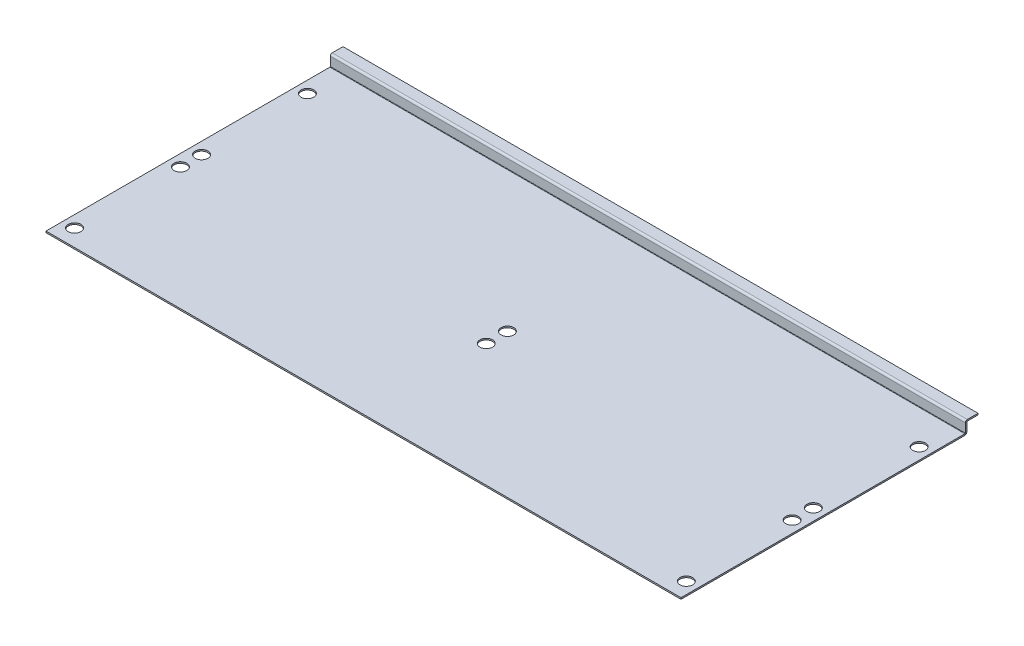
ISO-10303-21;
HEADER;
FILE_DESCRIPTION(('STEP AP214'),'2;1');
FILE_NAME('part.step','',(''),(''),'','','');
FILE_SCHEMA(('AUTOMOTIVE_DESIGN { 1 0 10303 214 1 1 1 1 }'));
ENDSEC;
DATA;
#1=APPLICATION_CONTEXT('core data for automotive mechanical design processes');
#2=APPLICATION_PROTOCOL_DEFINITION('international standard','automotive_design',2000,#1);
#3=PRODUCT_CONTEXT('',#1,'mechanical');
#4=PRODUCT('Part','Part','',(#3));
#5=PRODUCT_RELATED_PRODUCT_CATEGORY('part','',(#4));
#6=PRODUCT_DEFINITION_FORMATION('','',#4);
#7=PRODUCT_DEFINITION_CONTEXT('part definition',#1,'design');
#8=PRODUCT_DEFINITION('design','',#6,#7);
#9=PRODUCT_DEFINITION_SHAPE('','',#8);
#10=(LENGTH_UNIT() NAMED_UNIT(*) SI_UNIT(.MILLI.,.METRE.));
#11=(NAMED_UNIT(*) PLANE_ANGLE_UNIT() SI_UNIT($,.RADIAN.));
#12=(NAMED_UNIT(*) SI_UNIT($,.STERADIAN.) SOLID_ANGLE_UNIT());
#13=UNCERTAINTY_MEASURE_WITH_UNIT(LENGTH_MEASURE(1.E-05),#10,'distance_accuracy_value','');
#14=(GEOMETRIC_REPRESENTATION_CONTEXT(3) GLOBAL_UNCERTAINTY_ASSIGNED_CONTEXT((#13)) GLOBAL_UNIT_ASSIGNED_CONTEXT((#10,
#11,#12)) REPRESENTATION_CONTEXT('',''));
#15=CARTESIAN_POINT('',(0.,0.,0.));
#16=DIRECTION('',(0.,0.,1.));
#17=DIRECTION('',(1.,0.,0.));
#18=AXIS2_PLACEMENT_3D('',#15,#16,#17);
#19=CARTESIAN_POINT('',(150.,4.6,-67.5000000000001));
#20=DIRECTION('',(-1.,0.,0.));
#21=DIRECTION('',(0.,0.,1.));
#22=AXIS2_PLACEMENT_3D('',#19,#20,#21);
#23=PLANE('',#22);
#24=DIRECTION('',(0.,0.,1.));
#25=VECTOR('',#24,1.);
#26=CARTESIAN_POINT('',(150.,3.70000000000001,-67.5));
#27=LINE('',#26,#25);
#28=CARTESIAN_POINT('',(150.,3.70000000000001,-67.5));
#29=VERTEX_POINT('',#28);
#30=CARTESIAN_POINT('',(150.,3.70000000000001,-66.8000000000001));
#31=VERTEX_POINT('',#30);
#32=EDGE_CURVE('E247',#29,#31,#27,.T.);
#33=ORIENTED_EDGE('',*,*,#32,.T.);
#34=DIRECTION('',(0.,-1.,0.));
#35=VECTOR('',#34,1.);
#36=CARTESIAN_POINT('',(150.,4.6,-66.8000000000001));
#37=LINE('',#36,#35);
#38=CARTESIAN_POINT('',(150.,-0.49999999999998,-66.8));
#39=VERTEX_POINT('',#38);
#40=EDGE_CURVE('E268',#39,#31,#37,.F.);
#41=ORIENTED_EDGE('',*,*,#40,.F.);
#42=DIRECTION('',(0.,0.,1.));
#43=VECTOR('',#42,1.);
#44=CARTESIAN_POINT('',(150.,-0.499999999999974,-66.8));
#45=LINE('',#44,#43);
#46=CARTESIAN_POINT('',(150.,-0.499999999999979,-67.5000000000001));
#47=VERTEX_POINT('',#46);
#48=EDGE_CURVE('E276',#39,#47,#45,.F.);
#49=ORIENTED_EDGE('',*,*,#48,.T.);
#50=DIRECTION('',(0.,1.,0.));
#51=VECTOR('',#50,1.);
#52=CARTESIAN_POINT('',(150.,-1.40000000000018,-67.5000000000001));
#53=LINE('',#52,#51);
#54=EDGE_CURVE('E260',#47,#29,#53,.T.);
#55=ORIENTED_EDGE('',*,*,#54,.T.);
#56=EDGE_LOOP('',(#33,#41,#49,#55));
#57=FACE_BOUND('',#56,.T.);
#58=ADVANCED_FACE('F81',(#57),#23,.F.);
#59=CARTESIAN_POINT('',(-150.,-0.700000000000003,-67.5));
#60=DIRECTION('',(1.,0.,0.));
#61=DIRECTION('',(0.,0.,-1.));
#62=AXIS2_PLACEMENT_3D('',#59,#60,#61);
#63=PLANE('',#62);
#64=DIRECTION('',(0.,0.,1.));
#65=VECTOR('',#64,1.);
#66=CARTESIAN_POINT('',(-150.,3.70000000000001,-67.5));
#67=LINE('',#66,#65);
#68=CARTESIAN_POINT('',(-150.,3.70000000000001,-67.5));
#69=VERTEX_POINT('',#68);
#70=CARTESIAN_POINT('',(-150.,3.70000000000001,-66.8000000000001));
#71=VERTEX_POINT('',#70);
#72=EDGE_CURVE('E234',#69,#71,#67,.T.);
#73=ORIENTED_EDGE('',*,*,#72,.F.);
#74=DIRECTION('',(0.,-1.,0.));
#75=VECTOR('',#74,1.);
#76=CARTESIAN_POINT('',(-150.,-1.40000000000018,-67.5));
#77=LINE('',#76,#75);
#78=CARTESIAN_POINT('',(-150.,-0.499999999999982,-67.5));
#79=VERTEX_POINT('',#78);
#80=EDGE_CURVE('E255',#69,#79,#77,.T.);
#81=ORIENTED_EDGE('',*,*,#80,.T.);
#82=DIRECTION('',(0.,0.,1.));
#83=VECTOR('',#82,1.);
#84=CARTESIAN_POINT('',(-150.,-0.499999999999993,-67.5));
#85=LINE('',#84,#83);
#86=CARTESIAN_POINT('',(-150.,-0.49999999999998,-66.8));
#87=VERTEX_POINT('',#86);
#88=EDGE_CURVE('E251',#87,#79,#85,.F.);
#89=ORIENTED_EDGE('',*,*,#88,.F.);
#90=DIRECTION('',(0.,1.,0.));
#91=VECTOR('',#90,1.);
#92=CARTESIAN_POINT('',(-150.,-0.700000000000001,-66.8));
#93=LINE('',#92,#91);
#94=EDGE_CURVE('E264',#71,#87,#93,.F.);
#95=ORIENTED_EDGE('',*,*,#94,.F.);
#96=EDGE_LOOP('',(#73,#81,#89,#95));
#97=FACE_BOUND('',#96,.T.);
#98=ADVANCED_FACE('F449',(#97),#63,.F.);
#99=CARTESIAN_POINT('',(0.,-1.40000000000018,-67.5));
#100=DIRECTION('',(0.,0.,1.));
#101=DIRECTION('',(0.,1.,0.));
#102=AXIS2_PLACEMENT_3D('',#99,#100,#101);
#103=PLANE('',#102);
#104=DIRECTION('',(-1.,0.,0.));
#105=VECTOR('',#104,1.);
#106=CARTESIAN_POINT('',(-150.,3.70000000000001,-67.5));
#107=LINE('',#106,#105);
#108=EDGE_CURVE('E241',#69,#29,#107,.F.);
#109=ORIENTED_EDGE('',*,*,#108,.T.);
#110=ORIENTED_EDGE('',*,*,#54,.F.);
#111=DIRECTION('',(1.,0.,0.));
#112=VECTOR('',#111,1.);
#113=CARTESIAN_POINT('',(-150.,-0.499999999999993,-67.5));
#114=LINE('',#113,#112);
#115=EDGE_CURVE('E272',#47,#79,#114,.F.);
#116=ORIENTED_EDGE('',*,*,#115,.T.);
#117=ORIENTED_EDGE('',*,*,#80,.F.);
#118=EDGE_LOOP('',(#109,#110,#116,#117));
#119=FACE_BOUND('',#118,.T.);
#120=ADVANCED_FACE('F451',(#119),#103,.F.);
#121=CARTESIAN_POINT('',(0.,-1.40000000000018,-66.8));
#122=DIRECTION('',(0.,0.,1.));
#123=DIRECTION('',(0.,1.,0.));
#124=AXIS2_PLACEMENT_3D('',#121,#122,#123);
#125=PLANE('',#124);
#126=ORIENTED_EDGE('',*,*,#94,.T.);
#127=DIRECTION('',(1.,0.,0.));
#128=VECTOR('',#127,1.);
#129=CARTESIAN_POINT('',(-150.,-0.499999999999988,-66.8));
#130=LINE('',#129,#128);
#131=EDGE_CURVE('E280',#87,#39,#130,.T.);
#132=ORIENTED_EDGE('',*,*,#131,.T.);
#133=ORIENTED_EDGE('',*,*,#40,.T.);
#134=DIRECTION('',(-1.,0.,0.));
#135=VECTOR('',#134,1.);
#136=CARTESIAN_POINT('',(-150.,3.70000000000001,-66.8000000000001));
#137=LINE('',#136,#135);
#138=EDGE_CURVE('E228',#71,#31,#137,.F.);
#139=ORIENTED_EDGE('',*,*,#138,.F.);
#140=EDGE_LOOP('',(#126,#132,#133,#139));
#141=FACE_BOUND('',#140,.T.);
#142=ADVANCED_FACE('F456',(#141),#125,.T.);
#143=CARTESIAN_POINT('',(150.,-0.7,-67.5));
#144=DIRECTION('',(1.,0.,0.));
#145=DIRECTION('',(0.,0.,-1.));
#146=AXIS2_PLACEMENT_3D('',#143,#144,#145);
#147=PLANE('',#146);
#148=DIRECTION('',(0.,0.,-1.));
#149=VECTOR('',#148,1.);
#150=CARTESIAN_POINT('',(150.,-0.7,-67.5));
#151=LINE('',#150,#149);
#152=CARTESIAN_POINT('',(150.,-0.7,67.5));
#153=VERTEX_POINT('',#152);
#154=CARTESIAN_POINT('',(150.,-0.699999999999958,-66.6000000000001));
#155=VERTEX_POINT('',#154);
#156=EDGE_CURVE('E392',#153,#155,#151,.T.);
#157=ORIENTED_EDGE('',*,*,#156,.F.);
#158=DIRECTION('',(0.,-1.,0.));
#159=VECTOR('',#158,1.);
#160=CARTESIAN_POINT('',(150.,-0.7,67.5));
#161=LINE('',#160,#159);
#162=CARTESIAN_POINT('',(150.,-1.4,67.5));
#163=VERTEX_POINT('',#162);
#164=EDGE_CURVE('E13',#153,#163,#161,.T.);
#165=ORIENTED_EDGE('',*,*,#164,.T.);
#166=DIRECTION('',(0.,0.,-1.));
#167=VECTOR('',#166,1.);
#168=CARTESIAN_POINT('',(150.,-1.4,-67.5));
#169=LINE('',#168,#167);
#170=CARTESIAN_POINT('',(150.,-1.39999999999996,-66.6000000000002));
#171=VERTEX_POINT('',#170);
#172=EDGE_CURVE('E388',#163,#171,#169,.T.);
#173=ORIENTED_EDGE('',*,*,#172,.T.);
#174=DIRECTION('',(0.,-1.,-1.3877787807816E-13));
#175=VECTOR('',#174,1.);
#176=CARTESIAN_POINT('',(150.,-0.699999999999958,-66.6000000000001));
#177=LINE('',#176,#175);
#178=EDGE_CURVE('E293',#155,#171,#177,.T.);
#179=ORIENTED_EDGE('',*,*,#178,.F.);
#180=EDGE_LOOP('',(#157,#165,#173,#179));
#181=FACE_BOUND('',#180,.T.);
#182=ADVANCED_FACE('F83',(#181),#147,.T.);
#183=CARTESIAN_POINT('',(0.,-0.7,0.));
#184=DIRECTION('',(0.,-1.,0.));
#185=DIRECTION('',(0.,0.,1.));
#186=AXIS2_PLACEMENT_3D('',#183,#184,#185);
#187=PLANE('',#186);
#188=CARTESIAN_POINT('',(-144.5,-0.7,59.5));
#189=DIRECTION('',(0.,1.,0.));
#190=DIRECTION('',(0.,0.,1.));
#191=AXIS2_PLACEMENT_3D('',#188,#189,#190);
#192=CIRCLE('',#191,2.99999999999999);
#193=CARTESIAN_POINT('',(-144.5,-0.7,62.5));
#194=VERTEX_POINT('',#193);
#195=EDGE_CURVE('E384',#194,#194,#192,.T.);
#196=ORIENTED_EDGE('',*,*,#195,.F.);
#197=EDGE_LOOP('',(#196));
#198=FACE_BOUND('',#197,.T.);
#199=CARTESIAN_POINT('',(-144.5,-0.7,9.5));
#200=DIRECTION('',(0.,1.,0.));
#201=DIRECTION('',(0.,0.,1.));
#202=AXIS2_PLACEMENT_3D('',#199,#200,#201);
#203=CIRCLE('',#202,2.99999999999999);
#204=CARTESIAN_POINT('',(-144.5,-0.7,12.5));
#205=VERTEX_POINT('',#204);
#206=EDGE_CURVE('E376',#205,#205,#203,.T.);
#207=ORIENTED_EDGE('',*,*,#206,.F.);
#208=EDGE_LOOP('',(#207));
#209=FACE_BOUND('',#208,.T.);
#210=CARTESIAN_POINT('',(-144.5,-0.7,-0.499999999999999));
#211=DIRECTION('',(0.,1.,0.));
#212=DIRECTION('',(0.,0.,1.));
#213=AXIS2_PLACEMENT_3D('',#210,#211,#212);
#214=CIRCLE('',#213,2.99999999999999);
#215=CARTESIAN_POINT('',(-144.5,-0.7,2.5));
#216=VERTEX_POINT('',#215);
#217=EDGE_CURVE('E368',#216,#216,#214,.T.);
#218=ORIENTED_EDGE('',*,*,#217,.F.);
#219=EDGE_LOOP('',(#218));
#220=FACE_BOUND('',#219,.T.);
#221=CARTESIAN_POINT('',(-144.5,-0.7,-50.5));
#222=DIRECTION('',(0.,1.,0.));
#223=DIRECTION('',(0.,0.,1.));
#224=AXIS2_PLACEMENT_3D('',#221,#222,#223);
#225=CIRCLE('',#224,2.99999999999999);
#226=CARTESIAN_POINT('',(-144.5,-0.7,-47.5));
#227=VERTEX_POINT('',#226);
#228=EDGE_CURVE('E360',#227,#227,#225,.T.);
#229=ORIENTED_EDGE('',*,*,#228,.F.);
#230=EDGE_LOOP('',(#229));
#231=FACE_BOUND('',#230,.T.);
#232=CARTESIAN_POINT('',(144.5,-0.7,59.5));
#233=DIRECTION('',(0.,1.,0.));
#234=DIRECTION('',(0.,0.,-1.));
#235=AXIS2_PLACEMENT_3D('',#232,#233,#234);
#236=CIRCLE('',#235,2.99999999999999);
#237=CARTESIAN_POINT('',(144.5,-0.7,56.5));
#238=VERTEX_POINT('',#237);
#239=EDGE_CURVE('E352',#238,#238,#236,.T.);
#240=ORIENTED_EDGE('',*,*,#239,.F.);
#241=EDGE_LOOP('',(#240));
#242=FACE_BOUND('',#241,.T.);
#243=CARTESIAN_POINT('',(144.5,-0.7,9.49999999999997));
#244=DIRECTION('',(0.,1.,0.));
#245=DIRECTION('',(0.,0.,-1.));
#246=AXIS2_PLACEMENT_3D('',#243,#244,#245);
#247=CIRCLE('',#246,2.99999999999999);
#248=CARTESIAN_POINT('',(144.5,-0.7,6.49999999999997));
#249=VERTEX_POINT('',#248);
#250=EDGE_CURVE('E344',#249,#249,#247,.T.);
#251=ORIENTED_EDGE('',*,*,#250,.F.);
#252=EDGE_LOOP('',(#251));
#253=FACE_BOUND('',#252,.T.);
#254=CARTESIAN_POINT('',(144.5,-0.7,-0.500000000000034));
#255=DIRECTION('',(0.,1.,0.));
#256=DIRECTION('',(0.,0.,-1.));
#257=AXIS2_PLACEMENT_3D('',#254,#255,#256);
#258=CIRCLE('',#257,2.99999999999999);
#259=CARTESIAN_POINT('',(144.5,-0.7,-3.50000000000003));
#260=VERTEX_POINT('',#259);
#261=EDGE_CURVE('E336',#260,#260,#258,.T.);
#262=ORIENTED_EDGE('',*,*,#261,.F.);
#263=EDGE_LOOP('',(#262));
#264=FACE_BOUND('',#263,.T.);
#265=CARTESIAN_POINT('',(144.5,-0.7,-50.5));
#266=DIRECTION('',(0.,1.,0.));
#267=DIRECTION('',(0.,0.,-1.));
#268=AXIS2_PLACEMENT_3D('',#265,#266,#267);
#269=CIRCLE('',#268,2.99999999999999);
#270=CARTESIAN_POINT('',(144.5,-0.7,-53.5));
#271=VERTEX_POINT('',#270);
#272=EDGE_CURVE('E328',#271,#271,#269,.T.);
#273=ORIENTED_EDGE('',*,*,#272,.F.);
#274=EDGE_LOOP('',(#273));
#275=FACE_BOUND('',#274,.T.);
#276=CARTESIAN_POINT('',(0.,-0.7,9.5));
#277=DIRECTION('',(0.,1.,0.));
#278=DIRECTION('',(0.,0.,1.));
#279=AXIS2_PLACEMENT_3D('',#276,#277,#278);
#280=CIRCLE('',#279,3.);
#281=CARTESIAN_POINT('',(0.,-0.7,12.5));
#282=VERTEX_POINT('',#281);
#283=EDGE_CURVE('E320',#282,#282,#280,.T.);
#284=ORIENTED_EDGE('',*,*,#283,.F.);
#285=EDGE_LOOP('',(#284));
#286=FACE_BOUND('',#285,.T.);
#287=CARTESIAN_POINT('',(0.,-0.7,-0.499999999999999));
#288=DIRECTION('',(0.,1.,0.));
#289=DIRECTION('',(0.,0.,1.));
#290=AXIS2_PLACEMENT_3D('',#287,#288,#289);
#291=CIRCLE('',#290,3.);
#292=CARTESIAN_POINT('',(0.,-0.7,2.5));
#293=VERTEX_POINT('',#292);
#294=EDGE_CURVE('E312',#293,#293,#291,.T.);
#295=ORIENTED_EDGE('',*,*,#294,.F.);
#296=EDGE_LOOP('',(#295));
#297=FACE_BOUND('',#296,.T.);
#298=DIRECTION('',(1.,0.,0.));
#299=VECTOR('',#298,1.);
#300=CARTESIAN_POINT('',(150.,-0.699999999999958,-66.6000000000001));
#301=LINE('',#300,#299);
#302=CARTESIAN_POINT('',(-150.,-0.699999999999958,-66.6000000000001));
#303=VERTEX_POINT('',#302);
#304=EDGE_CURVE('E299',#155,#303,#301,.F.);
#305=ORIENTED_EDGE('',*,*,#304,.T.);
#306=DIRECTION('',(0.,0.,1.));
#307=VECTOR('',#306,1.);
#308=CARTESIAN_POINT('',(-150.,-0.7,-67.5));
#309=LINE('',#308,#307);
#310=CARTESIAN_POINT('',(-150.,-0.7,67.5));
#311=VERTEX_POINT('',#310);
#312=EDGE_CURVE('E396',#303,#311,#309,.T.);
#313=ORIENTED_EDGE('',*,*,#312,.T.);
#314=DIRECTION('',(1.,0.,0.));
#315=VECTOR('',#314,1.);
#316=CARTESIAN_POINT('',(-150.,-0.7,67.5));
#317=LINE('',#316,#315);
#318=EDGE_CURVE('E401',#311,#153,#317,.T.);
#319=ORIENTED_EDGE('',*,*,#318,.T.);
#320=ORIENTED_EDGE('',*,*,#156,.T.);
#321=EDGE_LOOP('',(#305,#313,#319,#320));
#322=FACE_BOUND('',#321,.T.);
#323=ADVANCED_FACE('F426',(#198,#209,#220,#231,#242,#253,#264,#275,#286,#297,#322),#187,.F.);
#324=CARTESIAN_POINT('',(0.,-1.4,0.));
#325=DIRECTION('',(0.,-1.,0.));
#326=DIRECTION('',(0.,0.,1.));
#327=AXIS2_PLACEMENT_3D('',#324,#325,#326);
#328=PLANE('',#327);
#329=CARTESIAN_POINT('',(0.,-1.4,-0.499999999999999));
#330=DIRECTION('',(0.,1.,0.));
#331=DIRECTION('',(0.,0.,1.));
#332=AXIS2_PLACEMENT_3D('',#329,#330,#331);
#333=CIRCLE('',#332,3.);
#334=CARTESIAN_POINT('',(0.,-1.4,2.5));
#335=VERTEX_POINT('',#334);
#336=EDGE_CURVE('E308',#335,#335,#333,.T.);
#337=ORIENTED_EDGE('',*,*,#336,.T.);
#338=EDGE_LOOP('',(#337));
#339=FACE_BOUND('',#338,.T.);
#340=CARTESIAN_POINT('',(0.,-1.4,9.5));
#341=DIRECTION('',(0.,1.,0.));
#342=DIRECTION('',(0.,0.,1.));
#343=AXIS2_PLACEMENT_3D('',#340,#341,#342);
#344=CIRCLE('',#343,3.);
#345=CARTESIAN_POINT('',(0.,-1.4,12.5));
#346=VERTEX_POINT('',#345);
#347=EDGE_CURVE('E316',#346,#346,#344,.T.);
#348=ORIENTED_EDGE('',*,*,#347,.T.);
#349=EDGE_LOOP('',(#348));
#350=FACE_BOUND('',#349,.T.);
#351=CARTESIAN_POINT('',(144.5,-1.4,-50.5));
#352=DIRECTION('',(0.,1.,0.));
#353=DIRECTION('',(0.,0.,-1.));
#354=AXIS2_PLACEMENT_3D('',#351,#352,#353);
#355=CIRCLE('',#354,2.99999999999999);
#356=CARTESIAN_POINT('',(144.5,-1.4,-53.5));
#357=VERTEX_POINT('',#356);
#358=EDGE_CURVE('E324',#357,#357,#355,.T.);
#359=ORIENTED_EDGE('',*,*,#358,.T.);
#360=EDGE_LOOP('',(#359));
#361=FACE_BOUND('',#360,.T.);
#362=CARTESIAN_POINT('',(144.5,-1.4,-0.500000000000034));
#363=DIRECTION('',(0.,1.,0.));
#364=DIRECTION('',(0.,0.,-1.));
#365=AXIS2_PLACEMENT_3D('',#362,#363,#364);
#366=CIRCLE('',#365,2.99999999999999);
#367=CARTESIAN_POINT('',(144.5,-1.4,-3.50000000000003));
#368=VERTEX_POINT('',#367);
#369=EDGE_CURVE('E332',#368,#368,#366,.T.);
#370=ORIENTED_EDGE('',*,*,#369,.T.);
#371=EDGE_LOOP('',(#370));
#372=FACE_BOUND('',#371,.T.);
#373=CARTESIAN_POINT('',(144.5,-1.4,9.49999999999997));
#374=DIRECTION('',(0.,1.,0.));
#375=DIRECTION('',(0.,0.,-1.));
#376=AXIS2_PLACEMENT_3D('',#373,#374,#375);
#377=CIRCLE('',#376,2.99999999999999);
#378=CARTESIAN_POINT('',(144.5,-1.4,6.49999999999997));
#379=VERTEX_POINT('',#378);
#380=EDGE_CURVE('E340',#379,#379,#377,.T.);
#381=ORIENTED_EDGE('',*,*,#380,.T.);
#382=EDGE_LOOP('',(#381));
#383=FACE_BOUND('',#382,.T.);
#384=CARTESIAN_POINT('',(144.5,-1.4,59.5));
#385=DIRECTION('',(0.,1.,0.));
#386=DIRECTION('',(0.,0.,-1.));
#387=AXIS2_PLACEMENT_3D('',#384,#385,#386);
#388=CIRCLE('',#387,2.99999999999999);
#389=CARTESIAN_POINT('',(144.5,-1.4,56.5));
#390=VERTEX_POINT('',#389);
#391=EDGE_CURVE('E348',#390,#390,#388,.T.);
#392=ORIENTED_EDGE('',*,*,#391,.T.);
#393=EDGE_LOOP('',(#392));
#394=FACE_BOUND('',#393,.T.);
#395=CARTESIAN_POINT('',(-144.5,-1.4,-50.5));
#396=DIRECTION('',(0.,1.,0.));
#397=DIRECTION('',(0.,0.,1.));
#398=AXIS2_PLACEMENT_3D('',#395,#396,#397);
#399=CIRCLE('',#398,2.99999999999999);
#400=CARTESIAN_POINT('',(-144.5,-1.4,-47.5));
#401=VERTEX_POINT('',#400);
#402=EDGE_CURVE('E356',#401,#401,#399,.T.);
#403=ORIENTED_EDGE('',*,*,#402,.T.);
#404=EDGE_LOOP('',(#403));
#405=FACE_BOUND('',#404,.T.);
#406=CARTESIAN_POINT('',(-144.5,-1.4,-0.499999999999999));
#407=DIRECTION('',(0.,1.,0.));
#408=DIRECTION('',(0.,0.,1.));
#409=AXIS2_PLACEMENT_3D('',#406,#407,#408);
#410=CIRCLE('',#409,2.99999999999999);
#411=CARTESIAN_POINT('',(-144.5,-1.4,2.5));
#412=VERTEX_POINT('',#411);
#413=EDGE_CURVE('E364',#412,#412,#410,.T.);
#414=ORIENTED_EDGE('',*,*,#413,.T.);
#415=EDGE_LOOP('',(#414));
#416=FACE_BOUND('',#415,.T.);
#417=CARTESIAN_POINT('',(-144.5,-1.4,9.5));
#418=DIRECTION('',(0.,1.,0.));
#419=DIRECTION('',(0.,0.,1.));
#420=AXIS2_PLACEMENT_3D('',#417,#418,#419);
#421=CIRCLE('',#420,2.99999999999999);
#422=CARTESIAN_POINT('',(-144.5,-1.4,12.5));
#423=VERTEX_POINT('',#422);
#424=EDGE_CURVE('E372',#423,#423,#421,.T.);
#425=ORIENTED_EDGE('',*,*,#424,.T.);
#426=EDGE_LOOP('',(#425));
#427=FACE_BOUND('',#426,.T.);
#428=CARTESIAN_POINT('',(-144.5,-1.4,59.5));
#429=DIRECTION('',(0.,1.,0.));
#430=DIRECTION('',(0.,0.,1.));
#431=AXIS2_PLACEMENT_3D('',#428,#429,#430);
#432=CIRCLE('',#431,2.99999999999999);
#433=CARTESIAN_POINT('',(-144.5,-1.4,62.5));
#434=VERTEX_POINT('',#433);
#435=EDGE_CURVE('E380',#434,#434,#432,.T.);
#436=ORIENTED_EDGE('',*,*,#435,.T.);
#437=EDGE_LOOP('',(#436));
#438=FACE_BOUND('',#437,.T.);
#439=ORIENTED_EDGE('',*,*,#172,.F.);
#440=DIRECTION('',(1.,0.,0.));
#441=VECTOR('',#440,1.);
#442=CARTESIAN_POINT('',(-150.,-1.4,67.5));
#443=LINE('',#442,#441);
#444=CARTESIAN_POINT('',(-150.,-1.4,67.5));
#445=VERTEX_POINT('',#444);
#446=EDGE_CURVE('E397',#445,#163,#443,.T.);
#447=ORIENTED_EDGE('',*,*,#446,.F.);
#448=DIRECTION('',(0.,0.,1.));
#449=VECTOR('',#448,1.);
#450=CARTESIAN_POINT('',(-150.,-1.4,-67.5));
#451=LINE('',#450,#449);
#452=CARTESIAN_POINT('',(-150.,-1.4,-66.6000000000001));
#453=VERTEX_POINT('',#452);
#454=EDGE_CURVE('E407',#453,#445,#451,.T.);
#455=ORIENTED_EDGE('',*,*,#454,.F.);
#456=DIRECTION('',(1.,0.,0.));
#457=VECTOR('',#456,1.);
#458=CARTESIAN_POINT('',(150.,-1.39999999999996,-66.6000000000002));
#459=LINE('',#458,#457);
#460=EDGE_CURVE('E286',#171,#453,#459,.F.);
#461=ORIENTED_EDGE('',*,*,#460,.F.);
#462=EDGE_LOOP('',(#439,#447,#455,#461));
#463=FACE_BOUND('',#462,.T.);
#464=ADVANCED_FACE('F422',(#339,#350,#361,#372,#383,#394,#405,#416,#427,#438,#463),#328,.T.);
#465=CARTESIAN_POINT('',(-150.,-0.7,67.5));
#466=DIRECTION('',(0.,0.,1.));
#467=DIRECTION('',(1.,0.,0.));
#468=AXIS2_PLACEMENT_3D('',#465,#466,#467);
#469=PLANE('',#468);
#470=ORIENTED_EDGE('',*,*,#446,.T.);
#471=ORIENTED_EDGE('',*,*,#164,.F.);
#472=ORIENTED_EDGE('',*,*,#318,.F.);
#473=DIRECTION('',(0.,-1.,0.));
#474=VECTOR('',#473,1.);
#475=CARTESIAN_POINT('',(-150.,-0.7,67.5));
#476=LINE('',#475,#474);
#477=EDGE_CURVE('E85',#311,#445,#476,.T.);
#478=ORIENTED_EDGE('',*,*,#477,.T.);
#479=EDGE_LOOP('',(#470,#471,#472,#478));
#480=FACE_BOUND('',#479,.T.);
#481=ADVANCED_FACE('F416',(#480),#469,.T.);
#482=CARTESIAN_POINT('',(-150.,-0.7,-67.5));
#483=DIRECTION('',(-1.,0.,0.));
#484=DIRECTION('',(0.,0.,1.));
#485=AXIS2_PLACEMENT_3D('',#482,#483,#484);
#486=PLANE('',#485);
#487=DIRECTION('',(0.,-1.,-1.3877787807816E-13));
#488=VECTOR('',#487,1.);
#489=CARTESIAN_POINT('',(-150.,-0.699999999999958,-66.6000000000001));
#490=LINE('',#489,#488);
#491=EDGE_CURVE('E305',#303,#453,#490,.T.);
#492=ORIENTED_EDGE('',*,*,#491,.T.);
#493=ORIENTED_EDGE('',*,*,#454,.T.);
#494=ORIENTED_EDGE('',*,*,#477,.F.);
#495=ORIENTED_EDGE('',*,*,#312,.F.);
#496=EDGE_LOOP('',(#492,#493,#494,#495));
#497=FACE_BOUND('',#496,.T.);
#498=ADVANCED_FACE('F430',(#497),#486,.T.);
#499=CARTESIAN_POINT('',(-144.5,-0.7,59.5));
#500=DIRECTION('',(0.,-1.,0.));
#501=DIRECTION('',(0.,0.,1.));
#502=AXIS2_PLACEMENT_3D('',#499,#500,#501);
#503=CYLINDRICAL_SURFACE('',#502,2.99999999999999);
#504=ORIENTED_EDGE('',*,*,#195,.T.);
#505=EDGE_LOOP('',(#504));
#506=FACE_BOUND('',#505,.T.);
#507=ORIENTED_EDGE('',*,*,#435,.F.);
#508=EDGE_LOOP('',(#507));
#509=FACE_BOUND('',#508,.T.);
#510=ADVANCED_FACE('F525',(#506,#509),#503,.F.);
#511=CARTESIAN_POINT('',(-144.5,-0.7,9.5));
#512=DIRECTION('',(0.,-1.,0.));
#513=DIRECTION('',(0.,0.,1.));
#514=AXIS2_PLACEMENT_3D('',#511,#512,#513);
#515=CYLINDRICAL_SURFACE('',#514,2.99999999999999);
#516=ORIENTED_EDGE('',*,*,#206,.T.);
#517=EDGE_LOOP('',(#516));
#518=FACE_BOUND('',#517,.T.);
#519=ORIENTED_EDGE('',*,*,#424,.F.);
#520=EDGE_LOOP('',(#519));
#521=FACE_BOUND('',#520,.T.);
#522=ADVANCED_FACE('F521',(#518,#521),#515,.F.);
#523=CARTESIAN_POINT('',(-144.5,-0.7,-0.499999999999999));
#524=DIRECTION('',(0.,-1.,0.));
#525=DIRECTION('',(0.,0.,1.));
#526=AXIS2_PLACEMENT_3D('',#523,#524,#525);
#527=CYLINDRICAL_SURFACE('',#526,2.99999999999999);
#528=ORIENTED_EDGE('',*,*,#217,.T.);
#529=EDGE_LOOP('',(#528));
#530=FACE_BOUND('',#529,.T.);
#531=ORIENTED_EDGE('',*,*,#413,.F.);
#532=EDGE_LOOP('',(#531));
#533=FACE_BOUND('',#532,.T.);
#534=ADVANCED_FACE('F517',(#530,#533),#527,.F.);
#535=CARTESIAN_POINT('',(-144.5,-0.7,-50.5));
#536=DIRECTION('',(0.,-1.,0.));
#537=DIRECTION('',(0.,0.,1.));
#538=AXIS2_PLACEMENT_3D('',#535,#536,#537);
#539=CYLINDRICAL_SURFACE('',#538,2.99999999999999);
#540=ORIENTED_EDGE('',*,*,#228,.T.);
#541=EDGE_LOOP('',(#540));
#542=FACE_BOUND('',#541,.T.);
#543=ORIENTED_EDGE('',*,*,#402,.F.);
#544=EDGE_LOOP('',(#543));
#545=FACE_BOUND('',#544,.T.);
#546=ADVANCED_FACE('F513',(#542,#545),#539,.F.);
#547=CARTESIAN_POINT('',(144.5,-0.7,59.5));
#548=DIRECTION('',(0.,-1.,0.));
#549=DIRECTION('',(0.,0.,1.));
#550=AXIS2_PLACEMENT_3D('',#547,#548,#549);
#551=CYLINDRICAL_SURFACE('',#550,2.99999999999999);
#552=ORIENTED_EDGE('',*,*,#239,.T.);
#553=EDGE_LOOP('',(#552));
#554=FACE_BOUND('',#553,.T.);
#555=ORIENTED_EDGE('',*,*,#391,.F.);
#556=EDGE_LOOP('',(#555));
#557=FACE_BOUND('',#556,.T.);
#558=ADVANCED_FACE('F509',(#554,#557),#551,.F.);
#559=CARTESIAN_POINT('',(144.5,-0.7,9.49999999999997));
#560=DIRECTION('',(0.,-1.,0.));
#561=DIRECTION('',(0.,0.,1.));
#562=AXIS2_PLACEMENT_3D('',#559,#560,#561);
#563=CYLINDRICAL_SURFACE('',#562,2.99999999999999);
#564=ORIENTED_EDGE('',*,*,#250,.T.);
#565=EDGE_LOOP('',(#564));
#566=FACE_BOUND('',#565,.T.);
#567=ORIENTED_EDGE('',*,*,#380,.F.);
#568=EDGE_LOOP('',(#567));
#569=FACE_BOUND('',#568,.T.);
#570=ADVANCED_FACE('F505',(#566,#569),#563,.F.);
#571=CARTESIAN_POINT('',(144.5,-0.7,-0.500000000000034));
#572=DIRECTION('',(0.,-1.,0.));
#573=DIRECTION('',(0.,0.,1.));
#574=AXIS2_PLACEMENT_3D('',#571,#572,#573);
#575=CYLINDRICAL_SURFACE('',#574,2.99999999999999);
#576=ORIENTED_EDGE('',*,*,#261,.T.);
#577=EDGE_LOOP('',(#576));
#578=FACE_BOUND('',#577,.T.);
#579=ORIENTED_EDGE('',*,*,#369,.F.);
#580=EDGE_LOOP('',(#579));
#581=FACE_BOUND('',#580,.T.);
#582=ADVANCED_FACE('F501',(#578,#581),#575,.F.);
#583=CARTESIAN_POINT('',(144.5,-0.7,-50.5));
#584=DIRECTION('',(0.,-1.,0.));
#585=DIRECTION('',(0.,0.,1.));
#586=AXIS2_PLACEMENT_3D('',#583,#584,#585);
#587=CYLINDRICAL_SURFACE('',#586,2.99999999999999);
#588=ORIENTED_EDGE('',*,*,#272,.T.);
#589=EDGE_LOOP('',(#588));
#590=FACE_BOUND('',#589,.T.);
#591=ORIENTED_EDGE('',*,*,#358,.F.);
#592=EDGE_LOOP('',(#591));
#593=FACE_BOUND('',#592,.T.);
#594=ADVANCED_FACE('F497',(#590,#593),#587,.F.);
#595=CARTESIAN_POINT('',(0.,-0.7,9.5));
#596=DIRECTION('',(0.,-1.,0.));
#597=DIRECTION('',(0.,0.,1.));
#598=AXIS2_PLACEMENT_3D('',#595,#596,#597);
#599=CYLINDRICAL_SURFACE('',#598,3.);
#600=ORIENTED_EDGE('',*,*,#283,.T.);
#601=EDGE_LOOP('',(#600));
#602=FACE_BOUND('',#601,.T.);
#603=ORIENTED_EDGE('',*,*,#347,.F.);
#604=EDGE_LOOP('',(#603));
#605=FACE_BOUND('',#604,.T.);
#606=ADVANCED_FACE('F493',(#602,#605),#599,.F.);
#607=CARTESIAN_POINT('',(0.,-0.7,-0.499999999999999));
#608=DIRECTION('',(0.,-1.,0.));
#609=DIRECTION('',(0.,0.,1.));
#610=AXIS2_PLACEMENT_3D('',#607,#608,#609);
#611=CYLINDRICAL_SURFACE('',#610,3.);
#612=ORIENTED_EDGE('',*,*,#294,.T.);
#613=EDGE_LOOP('',(#612));
#614=FACE_BOUND('',#613,.T.);
#615=ORIENTED_EDGE('',*,*,#336,.F.);
#616=EDGE_LOOP('',(#615));
#617=FACE_BOUND('',#616,.T.);
#618=ADVANCED_FACE('F488',(#614,#617),#611,.F.);
#619=CARTESIAN_POINT('',(-150.,-0.49999999999998,-66.6));
#620=DIRECTION('',(-1.,0.,0.));
#621=DIRECTION('',(0.,0.,1.));
#622=AXIS2_PLACEMENT_3D('',#619,#620,#621);
#623=PLANE('',#622);
#624=ORIENTED_EDGE('',*,*,#88,.T.);
#625=CARTESIAN_POINT('',(-150.,-0.49999999999998,-66.6));
#626=DIRECTION('',(-1.,0.,0.));
#627=DIRECTION('',(0.,0.,-1.));
#628=AXIS2_PLACEMENT_3D('',#625,#626,#627);
#629=CIRCLE('',#628,0.899999999999978);
#630=EDGE_CURVE('E105',#453,#79,#629,.F.);
#631=ORIENTED_EDGE('',*,*,#630,.F.);
#632=ORIENTED_EDGE('',*,*,#491,.F.);
#633=CARTESIAN_POINT('',(-150.,-0.49999999999998,-66.6));
#634=DIRECTION('',(-1.,0.,0.));
#635=DIRECTION('',(0.,0.,-1.));
#636=AXIS2_PLACEMENT_3D('',#633,#634,#635);
#637=CIRCLE('',#636,0.199999999999978);
#638=EDGE_CURVE('E296',#303,#87,#637,.F.);
#639=ORIENTED_EDGE('',*,*,#638,.T.);
#640=EDGE_LOOP('',(#624,#631,#632,#639));
#641=FACE_BOUND('',#640,.T.);
#642=ADVANCED_FACE('F443',(#641),#623,.T.);
#643=CARTESIAN_POINT('',(150.,-0.49999999999998,-66.6));
#644=DIRECTION('',(-1.,0.,0.));
#645=DIRECTION('',(0.,0.,1.));
#646=AXIS2_PLACEMENT_3D('',#643,#644,#645);
#647=PLANE('',#646);
#648=CARTESIAN_POINT('',(150.,-0.49999999999998,-66.6));
#649=DIRECTION('',(-1.,0.,0.));
#650=DIRECTION('',(0.,0.,-1.));
#651=AXIS2_PLACEMENT_3D('',#648,#649,#650);
#652=CIRCLE('',#651,0.199999999999978);
#653=EDGE_CURVE('E259',#39,#155,#652,.T.);
#654=ORIENTED_EDGE('',*,*,#653,.T.);
#655=ORIENTED_EDGE('',*,*,#178,.T.);
#656=CARTESIAN_POINT('',(150.,-0.49999999999998,-66.6));
#657=DIRECTION('',(-1.,0.,0.));
#658=DIRECTION('',(0.,0.,-1.));
#659=AXIS2_PLACEMENT_3D('',#656,#657,#658);
#660=CIRCLE('',#659,0.899999999999978);
#661=EDGE_CURVE('E290',#47,#171,#660,.T.);
#662=ORIENTED_EDGE('',*,*,#661,.F.);
#663=ORIENTED_EDGE('',*,*,#48,.F.);
#664=EDGE_LOOP('',(#654,#655,#662,#663));
#665=FACE_BOUND('',#664,.T.);
#666=ADVANCED_FACE('F438',(#665),#647,.F.);
#667=CARTESIAN_POINT('',(150.,-0.49999999999998,-66.6));
#668=DIRECTION('',(1.,0.,0.));
#669=DIRECTION('',(0.,0.,-1.));
#670=AXIS2_PLACEMENT_3D('',#667,#668,#669);
#671=CYLINDRICAL_SURFACE('',#670,0.899999999999978);
#672=ORIENTED_EDGE('',*,*,#460,.T.);
#673=ORIENTED_EDGE('',*,*,#630,.T.);
#674=ORIENTED_EDGE('',*,*,#115,.F.);
#675=ORIENTED_EDGE('',*,*,#661,.T.);
#676=EDGE_LOOP('',(#672,#673,#674,#675));
#677=FACE_BOUND('',#676,.T.);
#678=ADVANCED_FACE('F433',(#677),#671,.T.);
#679=CARTESIAN_POINT('',(150.,-0.49999999999998,-66.6));
#680=DIRECTION('',(1.,0.,0.));
#681=DIRECTION('',(0.,0.,-1.));
#682=AXIS2_PLACEMENT_3D('',#679,#680,#681);
#683=CYLINDRICAL_SURFACE('',#682,0.199999999999978);
#684=ORIENTED_EDGE('',*,*,#304,.F.);
#685=ORIENTED_EDGE('',*,*,#653,.F.);
#686=ORIENTED_EDGE('',*,*,#131,.F.);
#687=ORIENTED_EDGE('',*,*,#638,.F.);
#688=EDGE_LOOP('',(#684,#685,#686,#687));
#689=FACE_BOUND('',#688,.T.);
#690=ADVANCED_FACE('F442',(#689),#683,.F.);
#691=CARTESIAN_POINT('',(150.,3.70000000000001,-67.7));
#692=DIRECTION('',(1.,0.,0.));
#693=DIRECTION('',(0.,0.,-1.));
#694=AXIS2_PLACEMENT_3D('',#691,#692,#693);
#695=PLANE('',#694);
#696=DIRECTION('',(0.,-1.,0.));
#697=VECTOR('',#696,1.);
#698=CARTESIAN_POINT('',(150.,4.6,-67.7000000000001));
#699=LINE('',#698,#697);
#700=CARTESIAN_POINT('',(150.,3.90000000000001,-67.7));
#701=VERTEX_POINT('',#700);
#702=CARTESIAN_POINT('',(150.,4.60000000000001,-67.7));
#703=VERTEX_POINT('',#702);
#704=EDGE_CURVE('E225',#701,#703,#699,.F.);
#705=ORIENTED_EDGE('',*,*,#704,.T.);
#706=CARTESIAN_POINT('',(150.,3.70000000000001,-67.7));
#707=DIRECTION('',(1.,0.,0.));
#708=DIRECTION('',(0.,0.,1.));
#709=AXIS2_PLACEMENT_3D('',#706,#707,#708);
#710=CIRCLE('',#709,0.9);
#711=EDGE_CURVE('E97',#31,#703,#710,.F.);
#712=ORIENTED_EDGE('',*,*,#711,.F.);
#713=ORIENTED_EDGE('',*,*,#32,.F.);
#714=CARTESIAN_POINT('',(150.,3.70000000000001,-67.7));
#715=DIRECTION('',(1.,0.,0.));
#716=DIRECTION('',(0.,0.,1.));
#717=AXIS2_PLACEMENT_3D('',#714,#715,#716);
#718=CIRCLE('',#717,0.200000000000001);
#719=EDGE_CURVE('E237',#29,#701,#718,.F.);
#720=ORIENTED_EDGE('',*,*,#719,.T.);
#721=EDGE_LOOP('',(#705,#712,#713,#720));
#722=FACE_BOUND('',#721,.T.);
#723=ADVANCED_FACE('F465',(#722),#695,.T.);
#724=CARTESIAN_POINT('',(-150.,3.70000000000001,-67.7));
#725=DIRECTION('',(1.,0.,0.));
#726=DIRECTION('',(0.,0.,-1.));
#727=AXIS2_PLACEMENT_3D('',#724,#725,#726);
#728=PLANE('',#727);
#729=CARTESIAN_POINT('',(-150.,3.70000000000001,-67.7));
#730=DIRECTION('',(1.,0.,0.));
#731=DIRECTION('',(0.,0.,1.));
#732=AXIS2_PLACEMENT_3D('',#729,#730,#731);
#733=CIRCLE('',#732,0.200000000000001);
#734=CARTESIAN_POINT('',(-150.,3.90000000000001,-67.7));
#735=VERTEX_POINT('',#734);
#736=EDGE_CURVE('E201',#735,#69,#733,.T.);
#737=ORIENTED_EDGE('',*,*,#736,.T.);
#738=ORIENTED_EDGE('',*,*,#72,.T.);
#739=CARTESIAN_POINT('',(-150.,3.70000000000001,-67.7));
#740=DIRECTION('',(1.,0.,0.));
#741=DIRECTION('',(0.,0.,1.));
#742=AXIS2_PLACEMENT_3D('',#739,#740,#741);
#743=CIRCLE('',#742,0.9);
#744=CARTESIAN_POINT('',(-150.,4.6,-67.7));
#745=VERTEX_POINT('',#744);
#746=EDGE_CURVE('E231',#745,#71,#743,.T.);
#747=ORIENTED_EDGE('',*,*,#746,.F.);
#748=DIRECTION('',(0.,-1.,0.));
#749=VECTOR('',#748,1.);
#750=CARTESIAN_POINT('',(-150.,3.90000000000001,-67.7));
#751=LINE('',#750,#749);
#752=EDGE_CURVE('E217',#735,#745,#751,.F.);
#753=ORIENTED_EDGE('',*,*,#752,.F.);
#754=EDGE_LOOP('',(#737,#738,#747,#753));
#755=FACE_BOUND('',#754,.T.);
#756=ADVANCED_FACE('F459',(#755),#728,.F.);
#757=CARTESIAN_POINT('',(-150.,3.70000000000001,-67.7));
#758=DIRECTION('',(-1.,0.,0.));
#759=DIRECTION('',(0.,1.,0.));
#760=AXIS2_PLACEMENT_3D('',#757,#758,#759);
#761=CYLINDRICAL_SURFACE('',#760,0.9);
#762=ORIENTED_EDGE('',*,*,#138,.T.);
#763=ORIENTED_EDGE('',*,*,#711,.T.);
#764=DIRECTION('',(-1.,0.,0.));
#765=VECTOR('',#764,1.);
#766=CARTESIAN_POINT('',(150.,4.6,-67.7000000000001));
#767=LINE('',#766,#765);
#768=EDGE_CURVE('E191',#745,#703,#767,.F.);
#769=ORIENTED_EDGE('',*,*,#768,.F.);
#770=ORIENTED_EDGE('',*,*,#746,.T.);
#771=EDGE_LOOP('',(#762,#763,#769,#770));
#772=FACE_BOUND('',#771,.T.);
#773=ADVANCED_FACE('F472',(#772),#761,.T.);
#774=CARTESIAN_POINT('',(-150.,3.70000000000001,-67.7));
#775=DIRECTION('',(-1.,0.,0.));
#776=DIRECTION('',(0.,1.,0.));
#777=AXIS2_PLACEMENT_3D('',#774,#775,#776);
#778=CYLINDRICAL_SURFACE('',#777,0.200000000000001);
#779=ORIENTED_EDGE('',*,*,#108,.F.);
#780=ORIENTED_EDGE('',*,*,#736,.F.);
#781=DIRECTION('',(-1.,0.,0.));
#782=VECTOR('',#781,1.);
#783=CARTESIAN_POINT('',(150.,3.90000000000001,-67.7000000000001));
#784=LINE('',#783,#782);
#785=EDGE_CURVE('E221',#701,#735,#784,.T.);
#786=ORIENTED_EDGE('',*,*,#785,.F.);
#787=ORIENTED_EDGE('',*,*,#719,.F.);
#788=EDGE_LOOP('',(#779,#780,#786,#787));
#789=FACE_BOUND('',#788,.T.);
#790=ADVANCED_FACE('F464',(#789),#778,.F.);
#791=CARTESIAN_POINT('',(-150.,4.6,-72.8));
#792=DIRECTION('',(1.,0.,0.));
#793=DIRECTION('',(0.,-1.,0.));
#794=AXIS2_PLACEMENT_3D('',#791,#792,#793);
#795=PLANE('',#794);
#796=ORIENTED_EDGE('',*,*,#752,.T.);
#797=DIRECTION('',(0.,0.,-1.));
#798=VECTOR('',#797,1.);
#799=CARTESIAN_POINT('',(-150.,4.59999999999994,0.));
#800=LINE('',#799,#798);
#801=CARTESIAN_POINT('',(-150.,4.6,-72.8));
#802=VERTEX_POINT('',#801);
#803=EDGE_CURVE('E186',#745,#802,#800,.T.);
#804=ORIENTED_EDGE('',*,*,#803,.T.);
#805=DIRECTION('',(0.,-1.,0.));
#806=VECTOR('',#805,1.);
#807=CARTESIAN_POINT('',(-150.,4.6,-72.8));
#808=LINE('',#807,#806);
#809=CARTESIAN_POINT('',(-150.,3.9,-72.8));
#810=VERTEX_POINT('',#809);
#811=EDGE_CURVE('E181',#802,#810,#808,.T.);
#812=ORIENTED_EDGE('',*,*,#811,.T.);
#813=DIRECTION('',(0.,0.,1.));
#814=VECTOR('',#813,1.);
#815=CARTESIAN_POINT('',(-150.,3.9,-72.8));
#816=LINE('',#815,#814);
#817=EDGE_CURVE('E211',#735,#810,#816,.F.);
#818=ORIENTED_EDGE('',*,*,#817,.F.);
#819=EDGE_LOOP('',(#796,#804,#812,#818));
#820=FACE_BOUND('',#819,.T.);
#821=ADVANCED_FACE('F626',(#820),#795,.F.);
#822=CARTESIAN_POINT('',(150.,4.6,-67.5000000000001));
#823=DIRECTION('',(-1.,0.,0.));
#824=DIRECTION('',(0.,1.,0.));
#825=AXIS2_PLACEMENT_3D('',#822,#823,#824);
#826=PLANE('',#825);
#827=ORIENTED_EDGE('',*,*,#704,.F.);
#828=DIRECTION('',(0.,0.,-1.));
#829=VECTOR('',#828,1.);
#830=CARTESIAN_POINT('',(150.,3.9,-67.5000000000001));
#831=LINE('',#830,#829);
#832=CARTESIAN_POINT('',(150.,3.9,-72.8000000000001));
#833=VERTEX_POINT('',#832);
#834=EDGE_CURVE('E197',#833,#701,#831,.F.);
#835=ORIENTED_EDGE('',*,*,#834,.F.);
#836=DIRECTION('',(0.,-1.,0.));
#837=VECTOR('',#836,1.);
#838=CARTESIAN_POINT('',(150.,4.6,-72.8000000000001));
#839=LINE('',#838,#837);
#840=CARTESIAN_POINT('',(150.,4.6,-72.8000000000001));
#841=VERTEX_POINT('',#840);
#842=EDGE_CURVE('E178',#841,#833,#839,.T.);
#843=ORIENTED_EDGE('',*,*,#842,.F.);
#844=DIRECTION('',(0.,0.,1.));
#845=VECTOR('',#844,1.);
#846=CARTESIAN_POINT('',(150.,4.59999999999994,0.));
#847=LINE('',#846,#845);
#848=EDGE_CURVE('E185',#841,#703,#847,.T.);
#849=ORIENTED_EDGE('',*,*,#848,.T.);
#850=EDGE_LOOP('',(#827,#835,#843,#849));
#851=FACE_BOUND('',#850,.T.);
#852=ADVANCED_FACE('F196',(#851),#826,.F.);
#853=CARTESIAN_POINT('',(0.,4.59999999999994,0.));
#854=DIRECTION('',(0.,-1.,0.));
#855=DIRECTION('',(0.,0.,1.));
#856=AXIS2_PLACEMENT_3D('',#853,#854,#855);
#857=PLANE('',#856);
#858=ORIENTED_EDGE('',*,*,#768,.T.);
#859=ORIENTED_EDGE('',*,*,#848,.F.);
#860=DIRECTION('',(1.,0.,0.));
#861=VECTOR('',#860,1.);
#862=CARTESIAN_POINT('',(0.,4.6,-72.8));
#863=LINE('',#862,#861);
#864=EDGE_CURVE('E174',#802,#841,#863,.T.);
#865=ORIENTED_EDGE('',*,*,#864,.F.);
#866=ORIENTED_EDGE('',*,*,#803,.F.);
#867=EDGE_LOOP('',(#858,#859,#865,#866));
#868=FACE_BOUND('',#867,.T.);
#869=ADVANCED_FACE('F189',(#868),#857,.F.);
#870=CARTESIAN_POINT('',(0.,3.89999999999994,0.));
#871=DIRECTION('',(0.,-1.,0.));
#872=DIRECTION('',(0.,0.,1.));
#873=AXIS2_PLACEMENT_3D('',#870,#871,#872);
#874=PLANE('',#873);
#875=ORIENTED_EDGE('',*,*,#817,.T.);
#876=DIRECTION('',(-1.,0.,0.));
#877=VECTOR('',#876,1.);
#878=CARTESIAN_POINT('',(150.,3.9,-72.8000000000001));
#879=LINE('',#878,#877);
#880=EDGE_CURVE('E208',#810,#833,#879,.F.);
#881=ORIENTED_EDGE('',*,*,#880,.T.);
#882=ORIENTED_EDGE('',*,*,#834,.T.);
#883=ORIENTED_EDGE('',*,*,#785,.T.);
#884=EDGE_LOOP('',(#875,#881,#882,#883));
#885=FACE_BOUND('',#884,.T.);
#886=ADVANCED_FACE('F651',(#885),#874,.T.);
#887=CARTESIAN_POINT('',(150.,4.6,-72.8000000000001));
#888=DIRECTION('',(0.,0.,1.));
#889=DIRECTION('',(0.,1.,0.));
#890=AXIS2_PLACEMENT_3D('',#887,#888,#889);
#891=PLANE('',#890);
#892=ORIENTED_EDGE('',*,*,#880,.F.);
#893=ORIENTED_EDGE('',*,*,#811,.F.);
#894=ORIENTED_EDGE('',*,*,#864,.T.);
#895=ORIENTED_EDGE('',*,*,#842,.T.);
#896=EDGE_LOOP('',(#892,#893,#894,#895));
#897=FACE_BOUND('',#896,.T.);
#898=ADVANCED_FACE('F176',(#897),#891,.F.);
#899=CLOSED_SHELL('',(#58,#98,#120,#142,#182,#323,#464,#481,#498,#510,#522,#534,#546,#558,#570,
#582,#594,#606,#618,#642,#666,#678,#690,#723,#756,#773,#790,#821,#852,#869,#886,#898));
#900=MANIFOLD_SOLID_BREP('B2',#899);
#901=ADVANCED_BREP_SHAPE_REPRESENTATION('',(#18,#900),#14);
#902=SHAPE_DEFINITION_REPRESENTATION(#9,#901);
ENDSEC;
END-ISO-10303-21;
